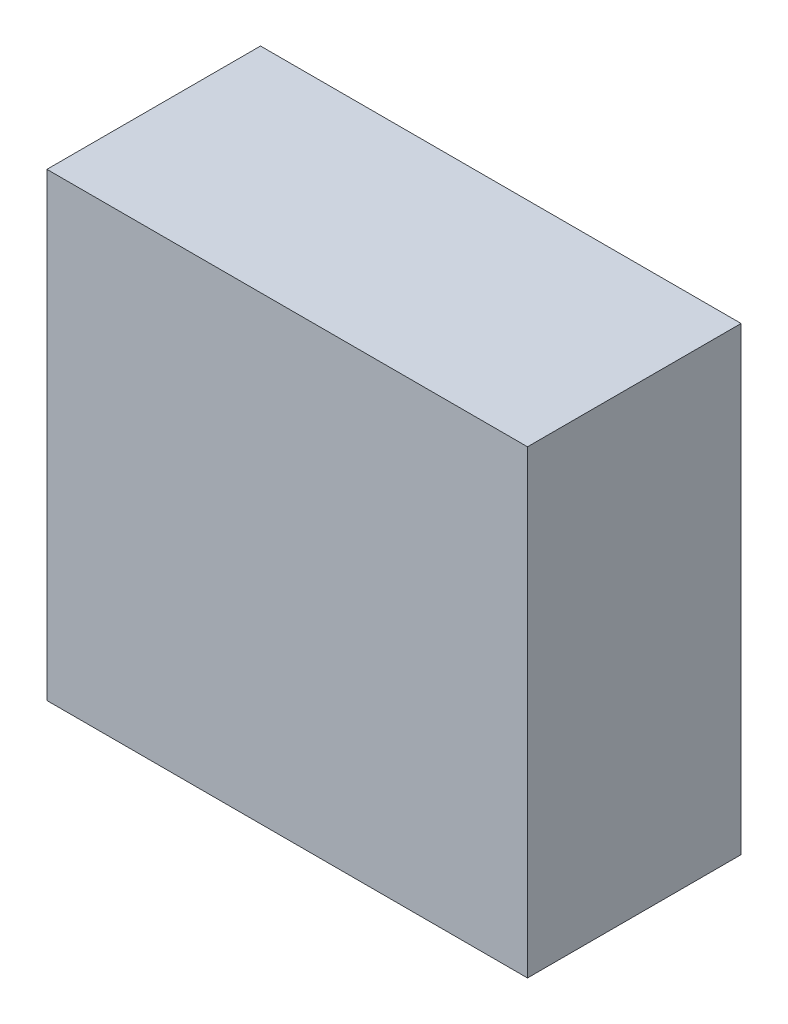
ISO-10303-21;
HEADER;
FILE_DESCRIPTION(('STEP AP214'),'2;1');
FILE_NAME('part.step','',(''),(''),'','','');
FILE_SCHEMA(('AUTOMOTIVE_DESIGN { 1 0 10303 214 1 1 1 1 }'));
ENDSEC;
DATA;
#1=APPLICATION_CONTEXT('core data for automotive mechanical design processes');
#2=APPLICATION_PROTOCOL_DEFINITION('international standard','automotive_design',2000,#1);
#3=PRODUCT_CONTEXT('',#1,'mechanical');
#4=PRODUCT('Part','Part','',(#3));
#5=PRODUCT_RELATED_PRODUCT_CATEGORY('part','',(#4));
#6=PRODUCT_DEFINITION_FORMATION('','',#4);
#7=PRODUCT_DEFINITION_CONTEXT('part definition',#1,'design');
#8=PRODUCT_DEFINITION('design','',#6,#7);
#9=PRODUCT_DEFINITION_SHAPE('','',#8);
#10=(LENGTH_UNIT() NAMED_UNIT(*) SI_UNIT(.MILLI.,.METRE.));
#11=(NAMED_UNIT(*) PLANE_ANGLE_UNIT() SI_UNIT($,.RADIAN.));
#12=(NAMED_UNIT(*) SI_UNIT($,.STERADIAN.) SOLID_ANGLE_UNIT());
#13=UNCERTAINTY_MEASURE_WITH_UNIT(LENGTH_MEASURE(1.E-05),#10,'distance_accuracy_value','');
#14=(GEOMETRIC_REPRESENTATION_CONTEXT(3) GLOBAL_UNCERTAINTY_ASSIGNED_CONTEXT((#13)) GLOBAL_UNIT_ASSIGNED_CONTEXT((#10,
#11,#12)) REPRESENTATION_CONTEXT('',''));
#15=CARTESIAN_POINT('',(0.,0.,0.));
#16=DIRECTION('',(0.,0.,1.));
#17=DIRECTION('',(1.,0.,0.));
#18=AXIS2_PLACEMENT_3D('',#15,#16,#17);
#19=CARTESIAN_POINT('',(-58.5,-56.,52.));
#20=DIRECTION('',(-1.,0.,0.));
#21=DIRECTION('',(0.,0.,1.));
#22=AXIS2_PLACEMENT_3D('',#19,#20,#21);
#23=PLANE('',#22);
#24=DIRECTION('',(0.,1.,0.));
#25=VECTOR('',#24,1.);
#26=CARTESIAN_POINT('',(-58.5,-56.,0.));
#27=LINE('',#26,#25);
#28=CARTESIAN_POINT('',(-58.5,-56.,0.));
#29=VERTEX_POINT('',#28);
#30=CARTESIAN_POINT('',(-58.5,56.,0.));
#31=VERTEX_POINT('',#30);
#32=EDGE_CURVE('E98',#29,#31,#27,.T.);
#33=ORIENTED_EDGE('',*,*,#32,.F.);
#34=DIRECTION('',(0.,0.,-1.));
#35=VECTOR('',#34,1.);
#36=CARTESIAN_POINT('',(-58.5,-56.,52.));
#37=LINE('',#36,#35);
#38=CARTESIAN_POINT('',(-58.5,-56.,52.));
#39=VERTEX_POINT('',#38);
#40=EDGE_CURVE('E11',#39,#29,#37,.T.);
#41=ORIENTED_EDGE('',*,*,#40,.F.);
#42=DIRECTION('',(0.,1.,0.));
#43=VECTOR('',#42,1.);
#44=CARTESIAN_POINT('',(-58.5,-56.,52.));
#45=LINE('',#44,#43);
#46=CARTESIAN_POINT('',(-58.5,56.,52.));
#47=VERTEX_POINT('',#46);
#48=EDGE_CURVE('E93',#39,#47,#45,.T.);
#49=ORIENTED_EDGE('',*,*,#48,.T.);
#50=DIRECTION('',(0.,0.,-1.));
#51=VECTOR('',#50,1.);
#52=CARTESIAN_POINT('',(-58.5,56.,52.));
#53=LINE('',#52,#51);
#54=EDGE_CURVE('E36',#47,#31,#53,.T.);
#55=ORIENTED_EDGE('',*,*,#54,.T.);
#56=EDGE_LOOP('',(#33,#41,#49,#55));
#57=FACE_BOUND('',#56,.T.);
#58=ADVANCED_FACE('F33',(#57),#23,.T.);
#59=CARTESIAN_POINT('',(-58.5,-56.,52.));
#60=DIRECTION('',(0.,1.,0.));
#61=DIRECTION('',(0.,0.,1.));
#62=AXIS2_PLACEMENT_3D('',#59,#60,#61);
#63=PLANE('',#62);
#64=DIRECTION('',(1.,0.,0.));
#65=VECTOR('',#64,1.);
#66=CARTESIAN_POINT('',(-58.5,-56.,0.));
#67=LINE('',#66,#65);
#68=CARTESIAN_POINT('',(58.5,-56.,0.));
#69=VERTEX_POINT('',#68);
#70=EDGE_CURVE('E66',#29,#69,#67,.T.);
#71=ORIENTED_EDGE('',*,*,#70,.T.);
#72=DIRECTION('',(0.,0.,-1.));
#73=VECTOR('',#72,1.);
#74=CARTESIAN_POINT('',(58.5,-56.,52.));
#75=LINE('',#74,#73);
#76=CARTESIAN_POINT('',(58.5,-56.,52.));
#77=VERTEX_POINT('',#76);
#78=EDGE_CURVE('E42',#77,#69,#75,.T.);
#79=ORIENTED_EDGE('',*,*,#78,.F.);
#80=DIRECTION('',(1.,0.,0.));
#81=VECTOR('',#80,1.);
#82=CARTESIAN_POINT('',(-58.5,-56.,52.));
#83=LINE('',#82,#81);
#84=EDGE_CURVE('E83',#39,#77,#83,.T.);
#85=ORIENTED_EDGE('',*,*,#84,.F.);
#86=ORIENTED_EDGE('',*,*,#40,.T.);
#87=EDGE_LOOP('',(#71,#79,#85,#86));
#88=FACE_BOUND('',#87,.T.);
#89=ADVANCED_FACE('F108',(#88),#63,.F.);
#90=CARTESIAN_POINT('',(58.5,-56.,52.));
#91=DIRECTION('',(-1.,0.,0.));
#92=DIRECTION('',(0.,0.,1.));
#93=AXIS2_PLACEMENT_3D('',#90,#91,#92);
#94=PLANE('',#93);
#95=DIRECTION('',(0.,1.,0.));
#96=VECTOR('',#95,1.);
#97=CARTESIAN_POINT('',(58.5,-56.,0.));
#98=LINE('',#97,#96);
#99=CARTESIAN_POINT('',(58.5,56.,0.));
#100=VERTEX_POINT('',#99);
#101=EDGE_CURVE('E90',#69,#100,#98,.T.);
#102=ORIENTED_EDGE('',*,*,#101,.T.);
#103=DIRECTION('',(0.,0.,-1.));
#104=VECTOR('',#103,1.);
#105=CARTESIAN_POINT('',(58.5,56.,52.));
#106=LINE('',#105,#104);
#107=CARTESIAN_POINT('',(58.5,56.,52.));
#108=VERTEX_POINT('',#107);
#109=EDGE_CURVE('E87',#108,#100,#106,.T.);
#110=ORIENTED_EDGE('',*,*,#109,.F.);
#111=DIRECTION('',(0.,1.,0.));
#112=VECTOR('',#111,1.);
#113=CARTESIAN_POINT('',(58.5,-56.,52.));
#114=LINE('',#113,#112);
#115=EDGE_CURVE('E78',#77,#108,#114,.T.);
#116=ORIENTED_EDGE('',*,*,#115,.F.);
#117=ORIENTED_EDGE('',*,*,#78,.T.);
#118=EDGE_LOOP('',(#102,#110,#116,#117));
#119=FACE_BOUND('',#118,.T.);
#120=ADVANCED_FACE('F88',(#119),#94,.F.);
#121=CARTESIAN_POINT('',(-58.5,56.,52.));
#122=DIRECTION('',(0.,1.,0.));
#123=DIRECTION('',(0.,0.,1.));
#124=AXIS2_PLACEMENT_3D('',#121,#122,#123);
#125=PLANE('',#124);
#126=DIRECTION('',(1.,0.,0.));
#127=VECTOR('',#126,1.);
#128=CARTESIAN_POINT('',(-58.5,56.,0.));
#129=LINE('',#128,#127);
#130=EDGE_CURVE('E101',#31,#100,#129,.T.);
#131=ORIENTED_EDGE('',*,*,#130,.F.);
#132=ORIENTED_EDGE('',*,*,#54,.F.);
#133=DIRECTION('',(1.,0.,0.));
#134=VECTOR('',#133,1.);
#135=CARTESIAN_POINT('',(-58.5,56.,52.));
#136=LINE('',#135,#134);
#137=EDGE_CURVE('E82',#47,#108,#136,.T.);
#138=ORIENTED_EDGE('',*,*,#137,.T.);
#139=ORIENTED_EDGE('',*,*,#109,.T.);
#140=EDGE_LOOP('',(#131,#132,#138,#139));
#141=FACE_BOUND('',#140,.T.);
#142=ADVANCED_FACE('F92',(#141),#125,.T.);
#143=CARTESIAN_POINT('',(0.,0.,52.));
#144=DIRECTION('',(0.,0.,-1.));
#145=DIRECTION('',(-1.,0.,0.));
#146=AXIS2_PLACEMENT_3D('',#143,#144,#145);
#147=PLANE('',#146);
#148=ORIENTED_EDGE('',*,*,#48,.F.);
#149=ORIENTED_EDGE('',*,*,#84,.T.);
#150=ORIENTED_EDGE('',*,*,#115,.T.);
#151=ORIENTED_EDGE('',*,*,#137,.F.);
#152=EDGE_LOOP('',(#148,#149,#150,#151));
#153=FACE_BOUND('',#152,.T.);
#154=ADVANCED_FACE('F81',(#153),#147,.F.);
#155=CARTESIAN_POINT('',(0.,0.,0.));
#156=DIRECTION('',(0.,0.,-1.));
#157=DIRECTION('',(-1.,0.,0.));
#158=AXIS2_PLACEMENT_3D('',#155,#156,#157);
#159=PLANE('',#158);
#160=ORIENTED_EDGE('',*,*,#32,.T.);
#161=ORIENTED_EDGE('',*,*,#130,.T.);
#162=ORIENTED_EDGE('',*,*,#101,.F.);
#163=ORIENTED_EDGE('',*,*,#70,.F.);
#164=EDGE_LOOP('',(#160,#161,#162,#163));
#165=FACE_BOUND('',#164,.T.);
#166=ADVANCED_FACE('F106',(#165),#159,.T.);
#167=CLOSED_SHELL('',(#58,#89,#120,#142,#154,#166));
#168=MANIFOLD_SOLID_BREP('B2',#167);
#169=ADVANCED_BREP_SHAPE_REPRESENTATION('',(#18,#168),#14);
#170=SHAPE_DEFINITION_REPRESENTATION(#9,#169);
ENDSEC;
END-ISO-10303-21;
